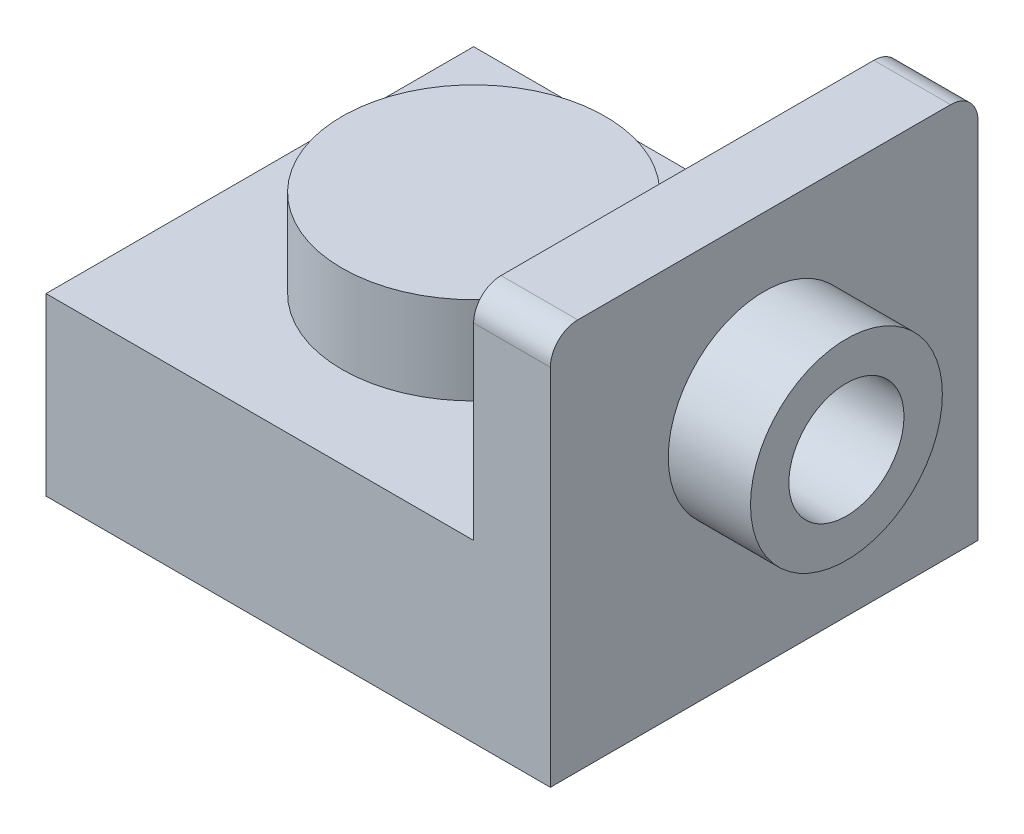
ISO-10303-21;
HEADER;
FILE_DESCRIPTION(('STEP AP214'),'2;1');
FILE_NAME('part.step','',(''),(''),'','','');
FILE_SCHEMA(('AUTOMOTIVE_DESIGN { 1 0 10303 214 1 1 1 1 }'));
ENDSEC;
DATA;
#1=APPLICATION_CONTEXT('core data for automotive mechanical design processes');
#2=APPLICATION_PROTOCOL_DEFINITION('international standard','automotive_design',2000,#1);
#3=PRODUCT_CONTEXT('',#1,'mechanical');
#4=PRODUCT('Part','Part','',(#3));
#5=PRODUCT_RELATED_PRODUCT_CATEGORY('part','',(#4));
#6=PRODUCT_DEFINITION_FORMATION('','',#4);
#7=PRODUCT_DEFINITION_CONTEXT('part definition',#1,'design');
#8=PRODUCT_DEFINITION('design','',#6,#7);
#9=PRODUCT_DEFINITION_SHAPE('','',#8);
#10=(LENGTH_UNIT() NAMED_UNIT(*) SI_UNIT(.MILLI.,.METRE.));
#11=(NAMED_UNIT(*) PLANE_ANGLE_UNIT() SI_UNIT($,.RADIAN.));
#12=(NAMED_UNIT(*) SI_UNIT($,.STERADIAN.) SOLID_ANGLE_UNIT());
#13=UNCERTAINTY_MEASURE_WITH_UNIT(LENGTH_MEASURE(1.E-05),#10,'distance_accuracy_value','');
#14=(GEOMETRIC_REPRESENTATION_CONTEXT(3) GLOBAL_UNCERTAINTY_ASSIGNED_CONTEXT((#13)) GLOBAL_UNIT_ASSIGNED_CONTEXT((#10,
#11,#12)) REPRESENTATION_CONTEXT('',''));
#15=CARTESIAN_POINT('',(0.,0.,0.));
#16=DIRECTION('',(0.,0.,1.));
#17=DIRECTION('',(1.,0.,0.));
#18=AXIS2_PLACEMENT_3D('',#15,#16,#17);
#19=CARTESIAN_POINT('',(0.,0.,-7.8));
#20=DIRECTION('',(-1.,0.,0.));
#21=DIRECTION('',(0.,0.,1.));
#22=AXIS2_PLACEMENT_3D('',#19,#20,#21);
#23=PLANE('',#22);
#24=DIRECTION('',(0.,-1.,0.));
#25=VECTOR('',#24,1.);
#26=CARTESIAN_POINT('',(0.,0.,0.));
#27=LINE('',#26,#25);
#28=CARTESIAN_POINT('',(0.,3.2,0.));
#29=VERTEX_POINT('',#28);
#30=CARTESIAN_POINT('',(0.,0.,0.));
#31=VERTEX_POINT('',#30);
#32=EDGE_CURVE('E205',#29,#31,#27,.T.);
#33=ORIENTED_EDGE('',*,*,#32,.F.);
#34=DIRECTION('',(0.,0.,1.));
#35=VECTOR('',#34,1.);
#36=CARTESIAN_POINT('',(0.,3.2,-7.8));
#37=LINE('',#36,#35);
#38=CARTESIAN_POINT('',(0.,3.2,-7.8));
#39=VERTEX_POINT('',#38);
#40=EDGE_CURVE('E210',#39,#29,#37,.T.);
#41=ORIENTED_EDGE('',*,*,#40,.F.);
#42=DIRECTION('',(0.,-1.,0.));
#43=VECTOR('',#42,1.);
#44=CARTESIAN_POINT('',(0.,0.,-7.8));
#45=LINE('',#44,#43);
#46=CARTESIAN_POINT('',(0.,0.,-7.8));
#47=VERTEX_POINT('',#46);
#48=EDGE_CURVE('E140',#39,#47,#45,.T.);
#49=ORIENTED_EDGE('',*,*,#48,.T.);
#50=DIRECTION('',(0.,0.,1.));
#51=VECTOR('',#50,1.);
#52=CARTESIAN_POINT('',(0.,0.,-7.8));
#53=LINE('',#52,#51);
#54=EDGE_CURVE('E136',#47,#31,#53,.T.);
#55=ORIENTED_EDGE('',*,*,#54,.T.);
#56=EDGE_LOOP('',(#33,#41,#49,#55));
#57=FACE_BOUND('',#56,.T.);
#58=ADVANCED_FACE('F39',(#57),#23,.T.);
#59=CARTESIAN_POINT('',(0.,3.2,-7.8));
#60=DIRECTION('',(0.,1.,0.));
#61=DIRECTION('',(0.,0.,1.));
#62=AXIS2_PLACEMENT_3D('',#59,#60,#61);
#63=PLANE('',#62);
#64=CARTESIAN_POINT('',(3.9,3.2,-3.9));
#65=DIRECTION('',(0.,1.,0.));
#66=DIRECTION('',(0.,0.,1.));
#67=AXIS2_PLACEMENT_3D('',#64,#65,#66);
#68=CIRCLE('',#67,2.4);
#69=CARTESIAN_POINT('',(3.9,3.2,-1.5));
#70=VERTEX_POINT('',#69);
#71=EDGE_CURVE('E206',#70,#70,#68,.T.);
#72=ORIENTED_EDGE('',*,*,#71,.F.);
#73=EDGE_LOOP('',(#72));
#74=FACE_BOUND('',#73,.T.);
#75=DIRECTION('',(-1.,0.,0.));
#76=VECTOR('',#75,1.);
#77=CARTESIAN_POINT('',(0.,3.2,0.));
#78=LINE('',#77,#76);
#79=CARTESIAN_POINT('',(7.8,3.2,0.));
#80=VERTEX_POINT('',#79);
#81=EDGE_CURVE('E211',#80,#29,#78,.T.);
#82=ORIENTED_EDGE('',*,*,#81,.F.);
#83=DIRECTION('',(0.,0.,1.));
#84=VECTOR('',#83,1.);
#85=CARTESIAN_POINT('',(7.8,3.2,-7.8));
#86=LINE('',#85,#84);
#87=CARTESIAN_POINT('',(7.8,3.2,-7.8));
#88=VERTEX_POINT('',#87);
#89=EDGE_CURVE('E222',#88,#80,#86,.T.);
#90=ORIENTED_EDGE('',*,*,#89,.F.);
#91=DIRECTION('',(-1.,0.,0.));
#92=VECTOR('',#91,1.);
#93=CARTESIAN_POINT('',(0.,3.2,-7.8));
#94=LINE('',#93,#92);
#95=EDGE_CURVE('E139',#88,#39,#94,.T.);
#96=ORIENTED_EDGE('',*,*,#95,.T.);
#97=ORIENTED_EDGE('',*,*,#40,.T.);
#98=EDGE_LOOP('',(#82,#90,#96,#97));
#99=FACE_BOUND('',#98,.T.);
#100=ADVANCED_FACE('F250',(#74,#99),#63,.T.);
#101=CARTESIAN_POINT('',(0.,0.,-7.8));
#102=DIRECTION('',(0.,-1.,0.));
#103=DIRECTION('',(0.,0.,-1.));
#104=AXIS2_PLACEMENT_3D('',#101,#102,#103);
#105=PLANE('',#104);
#106=DIRECTION('',(-1.,0.,0.));
#107=VECTOR('',#106,1.);
#108=CARTESIAN_POINT('',(1.2,0.,-1.2));
#109=LINE('',#108,#107);
#110=CARTESIAN_POINT('',(7.7,0.,-1.2));
#111=VERTEX_POINT('',#110);
#112=CARTESIAN_POINT('',(1.2,0.,-1.2));
#113=VERTEX_POINT('',#112);
#114=EDGE_CURVE('E177',#111,#113,#109,.T.);
#115=ORIENTED_EDGE('',*,*,#114,.F.);
#116=DIRECTION('',(0.,0.,1.));
#117=VECTOR('',#116,1.);
#118=CARTESIAN_POINT('',(7.7,0.,-1.2));
#119=LINE('',#118,#117);
#120=CARTESIAN_POINT('',(7.7,0.,-6.6));
#121=VERTEX_POINT('',#120);
#122=EDGE_CURVE('E168',#121,#111,#119,.T.);
#123=ORIENTED_EDGE('',*,*,#122,.F.);
#124=DIRECTION('',(1.,0.,0.));
#125=VECTOR('',#124,1.);
#126=CARTESIAN_POINT('',(7.7,0.,-6.6));
#127=LINE('',#126,#125);
#128=CARTESIAN_POINT('',(1.2,0.,-6.6));
#129=VERTEX_POINT('',#128);
#130=EDGE_CURVE('E171',#129,#121,#127,.T.);
#131=ORIENTED_EDGE('',*,*,#130,.F.);
#132=DIRECTION('',(0.,0.,-1.));
#133=VECTOR('',#132,1.);
#134=CARTESIAN_POINT('',(1.2,0.,-6.6));
#135=LINE('',#134,#133);
#136=EDGE_CURVE('E174',#113,#129,#135,.T.);
#137=ORIENTED_EDGE('',*,*,#136,.F.);
#138=EDGE_LOOP('',(#115,#123,#131,#137));
#139=FACE_BOUND('',#138,.T.);
#140=DIRECTION('',(1.,0.,0.));
#141=VECTOR('',#140,1.);
#142=CARTESIAN_POINT('',(0.,0.,0.));
#143=LINE('',#142,#141);
#144=CARTESIAN_POINT('',(9.2,0.,0.));
#145=VERTEX_POINT('',#144);
#146=EDGE_CURVE('E217',#31,#145,#143,.T.);
#147=ORIENTED_EDGE('',*,*,#146,.F.);
#148=ORIENTED_EDGE('',*,*,#54,.F.);
#149=DIRECTION('',(1.,0.,0.));
#150=VECTOR('',#149,1.);
#151=CARTESIAN_POINT('',(0.,0.,-7.8));
#152=LINE('',#151,#150);
#153=CARTESIAN_POINT('',(9.2,0.,-7.8));
#154=VERTEX_POINT('',#153);
#155=EDGE_CURVE('E131',#47,#154,#152,.T.);
#156=ORIENTED_EDGE('',*,*,#155,.T.);
#157=DIRECTION('',(0.,0.,-1.));
#158=VECTOR('',#157,1.);
#159=CARTESIAN_POINT('',(9.2,0.,-7.8));
#160=LINE('',#159,#158);
#161=EDGE_CURVE('E135',#145,#154,#160,.T.);
#162=ORIENTED_EDGE('',*,*,#161,.F.);
#163=EDGE_LOOP('',(#147,#148,#156,#162));
#164=FACE_BOUND('',#163,.T.);
#165=ADVANCED_FACE('F133',(#139,#164),#105,.T.);
#166=CARTESIAN_POINT('',(0.,0.,-7.8));
#167=DIRECTION('',(0.,0.,-1.));
#168=DIRECTION('',(-1.,0.,0.));
#169=AXIS2_PLACEMENT_3D('',#166,#167,#168);
#170=PLANE('',#169);
#171=DIRECTION('',(0.,1.,0.));
#172=VECTOR('',#171,1.);
#173=CARTESIAN_POINT('',(7.8,7.13462136884857,-7.8));
#174=LINE('',#173,#172);
#175=CARTESIAN_POINT('',(7.8,6.63462136884857,-7.8));
#176=VERTEX_POINT('',#175);
#177=EDGE_CURVE('E161',#88,#176,#174,.T.);
#178=ORIENTED_EDGE('',*,*,#177,.T.);
#179=DIRECTION('',(-1.,0.,0.));
#180=VECTOR('',#179,1.);
#181=CARTESIAN_POINT('',(9.2,6.63462136884857,-7.8));
#182=LINE('',#181,#180);
#183=CARTESIAN_POINT('',(9.2,6.63462136884857,-7.8));
#184=VERTEX_POINT('',#183);
#185=EDGE_CURVE('E62',#176,#184,#182,.F.);
#186=ORIENTED_EDGE('',*,*,#185,.T.);
#187=DIRECTION('',(0.,1.,0.));
#188=VECTOR('',#187,1.);
#189=CARTESIAN_POINT('',(9.2,7.13462136884857,-7.8));
#190=LINE('',#189,#188);
#191=EDGE_CURVE('E142',#154,#184,#190,.T.);
#192=ORIENTED_EDGE('',*,*,#191,.F.);
#193=ORIENTED_EDGE('',*,*,#155,.F.);
#194=ORIENTED_EDGE('',*,*,#48,.F.);
#195=ORIENTED_EDGE('',*,*,#95,.F.);
#196=EDGE_LOOP('',(#178,#186,#192,#193,#194,#195));
#197=FACE_BOUND('',#196,.T.);
#198=ADVANCED_FACE('F143',(#197),#170,.T.);
#199=CARTESIAN_POINT('',(0.,0.,0.));
#200=DIRECTION('',(0.,0.,-1.));
#201=DIRECTION('',(-1.,0.,0.));
#202=AXIS2_PLACEMENT_3D('',#199,#200,#201);
#203=PLANE('',#202);
#204=DIRECTION('',(0.,-1.,0.));
#205=VECTOR('',#204,1.);
#206=CARTESIAN_POINT('',(9.2,0.,0.));
#207=LINE('',#206,#205);
#208=CARTESIAN_POINT('',(9.2,6.63462136884857,0.));
#209=VERTEX_POINT('',#208);
#210=EDGE_CURVE('E148',#209,#145,#207,.T.);
#211=ORIENTED_EDGE('',*,*,#210,.F.);
#212=DIRECTION('',(-1.,0.,0.));
#213=VECTOR('',#212,1.);
#214=CARTESIAN_POINT('',(0.,6.63462136884857,0.));
#215=LINE('',#214,#213);
#216=CARTESIAN_POINT('',(7.8,6.63462136884857,0.));
#217=VERTEX_POINT('',#216);
#218=EDGE_CURVE('E47',#209,#217,#215,.T.);
#219=ORIENTED_EDGE('',*,*,#218,.T.);
#220=DIRECTION('',(0.,-1.,0.));
#221=VECTOR('',#220,1.);
#222=CARTESIAN_POINT('',(7.8,0.,0.));
#223=LINE('',#222,#221);
#224=EDGE_CURVE('E150',#217,#80,#223,.T.);
#225=ORIENTED_EDGE('',*,*,#224,.T.);
#226=ORIENTED_EDGE('',*,*,#81,.T.);
#227=ORIENTED_EDGE('',*,*,#32,.T.);
#228=ORIENTED_EDGE('',*,*,#146,.T.);
#229=EDGE_LOOP('',(#211,#219,#225,#226,#227,#228));
#230=FACE_BOUND('',#229,.T.);
#231=ADVANCED_FACE('F241',(#230),#203,.F.);
#232=CARTESIAN_POINT('',(3.9,4.8,-3.9));
#233=DIRECTION('',(0.,-1.,0.));
#234=DIRECTION('',(0.,0.,-1.));
#235=AXIS2_PLACEMENT_3D('',#232,#233,#234);
#236=CYLINDRICAL_SURFACE('',#235,2.4);
#237=CARTESIAN_POINT('',(3.9,4.8,-3.9));
#238=DIRECTION('',(0.,1.,0.));
#239=DIRECTION('',(0.,0.,1.));
#240=AXIS2_PLACEMENT_3D('',#237,#238,#239);
#241=CIRCLE('',#240,2.4);
#242=CARTESIAN_POINT('',(3.9,4.8,-1.5));
#243=VERTEX_POINT('',#242);
#244=EDGE_CURVE('E202',#243,#243,#241,.T.);
#245=ORIENTED_EDGE('',*,*,#244,.F.);
#246=EDGE_LOOP('',(#245));
#247=FACE_BOUND('',#246,.T.);
#248=ORIENTED_EDGE('',*,*,#71,.T.);
#249=EDGE_LOOP('',(#248));
#250=FACE_BOUND('',#249,.T.);
#251=ADVANCED_FACE('F315',(#247,#250),#236,.T.);
#252=CARTESIAN_POINT('',(3.9,4.8,-3.9));
#253=DIRECTION('',(0.,1.,0.));
#254=DIRECTION('',(0.,0.,1.));
#255=AXIS2_PLACEMENT_3D('',#252,#253,#254);
#256=PLANE('',#255);
#257=ORIENTED_EDGE('',*,*,#244,.T.);
#258=EDGE_LOOP('',(#257));
#259=FACE_BOUND('',#258,.T.);
#260=ADVANCED_FACE('F311',(#259),#256,.T.);
#261=CARTESIAN_POINT('',(0.,3.,-7.8));
#262=DIRECTION('',(0.,1.,0.));
#263=DIRECTION('',(0.,0.,1.));
#264=AXIS2_PLACEMENT_3D('',#261,#262,#263);
#265=PLANE('',#264);
#266=CARTESIAN_POINT('',(3.9,3.,-3.9));
#267=DIRECTION('',(0.,-1.,0.));
#268=DIRECTION('',(0.,0.,-1.));
#269=AXIS2_PLACEMENT_3D('',#266,#267,#268);
#270=CIRCLE('',#269,1.3);
#271=CARTESIAN_POINT('',(3.9,3.,-5.2));
#272=VERTEX_POINT('',#271);
#273=EDGE_CURVE('E160',#272,#272,#270,.T.);
#274=ORIENTED_EDGE('',*,*,#273,.F.);
#275=EDGE_LOOP('',(#274));
#276=FACE_BOUND('',#275,.T.);
#277=DIRECTION('',(0.,0.,1.));
#278=VECTOR('',#277,1.);
#279=CARTESIAN_POINT('',(7.7,3.,-1.2));
#280=LINE('',#279,#278);
#281=CARTESIAN_POINT('',(7.7,3.,-6.6));
#282=VERTEX_POINT('',#281);
#283=CARTESIAN_POINT('',(7.7,3.,-1.2));
#284=VERTEX_POINT('',#283);
#285=EDGE_CURVE('E185',#282,#284,#280,.T.);
#286=ORIENTED_EDGE('',*,*,#285,.T.);
#287=DIRECTION('',(-1.,0.,0.));
#288=VECTOR('',#287,1.);
#289=CARTESIAN_POINT('',(1.2,3.,-1.2));
#290=LINE('',#289,#288);
#291=CARTESIAN_POINT('',(1.2,3.,-1.2));
#292=VERTEX_POINT('',#291);
#293=EDGE_CURVE('E173',#284,#292,#290,.T.);
#294=ORIENTED_EDGE('',*,*,#293,.T.);
#295=DIRECTION('',(0.,0.,-1.));
#296=VECTOR('',#295,1.);
#297=CARTESIAN_POINT('',(1.2,3.,-6.6));
#298=LINE('',#297,#296);
#299=CARTESIAN_POINT('',(1.2,3.,-6.6));
#300=VERTEX_POINT('',#299);
#301=EDGE_CURVE('E194',#292,#300,#298,.T.);
#302=ORIENTED_EDGE('',*,*,#301,.T.);
#303=DIRECTION('',(1.,0.,0.));
#304=VECTOR('',#303,1.);
#305=CARTESIAN_POINT('',(7.7,3.,-6.6));
#306=LINE('',#305,#304);
#307=EDGE_CURVE('E190',#300,#282,#306,.T.);
#308=ORIENTED_EDGE('',*,*,#307,.T.);
#309=EDGE_LOOP('',(#286,#294,#302,#308));
#310=FACE_BOUND('',#309,.T.);
#311=ADVANCED_FACE('F307',(#276,#310),#265,.F.);
#312=CARTESIAN_POINT('',(1.2,11.6504437753292,-1.2));
#313=DIRECTION('',(0.,0.,1.));
#314=DIRECTION('',(1.,0.,0.));
#315=AXIS2_PLACEMENT_3D('',#312,#313,#314);
#316=PLANE('',#315);
#317=DIRECTION('',(0.,-1.,0.));
#318=VECTOR('',#317,1.);
#319=CARTESIAN_POINT('',(7.7,11.6504437753292,-1.2));
#320=LINE('',#319,#318);
#321=EDGE_CURVE('E188',#284,#111,#320,.T.);
#322=ORIENTED_EDGE('',*,*,#321,.T.);
#323=ORIENTED_EDGE('',*,*,#114,.T.);
#324=DIRECTION('',(0.,-1.,0.));
#325=VECTOR('',#324,1.);
#326=CARTESIAN_POINT('',(1.2,11.6504437753292,-1.2));
#327=LINE('',#326,#325);
#328=EDGE_CURVE('E184',#292,#113,#327,.T.);
#329=ORIENTED_EDGE('',*,*,#328,.F.);
#330=ORIENTED_EDGE('',*,*,#293,.F.);
#331=EDGE_LOOP('',(#322,#323,#329,#330));
#332=FACE_BOUND('',#331,.T.);
#333=ADVANCED_FACE('F303',(#332),#316,.F.);
#334=CARTESIAN_POINT('',(1.2,11.6504437753292,-6.6));
#335=DIRECTION('',(-1.,0.,0.));
#336=DIRECTION('',(0.,0.,1.));
#337=AXIS2_PLACEMENT_3D('',#334,#335,#336);
#338=PLANE('',#337);
#339=ORIENTED_EDGE('',*,*,#328,.T.);
#340=ORIENTED_EDGE('',*,*,#136,.T.);
#341=DIRECTION('',(0.,-1.,0.));
#342=VECTOR('',#341,1.);
#343=CARTESIAN_POINT('',(1.2,11.6504437753292,-6.6));
#344=LINE('',#343,#342);
#345=EDGE_CURVE('E193',#300,#129,#344,.T.);
#346=ORIENTED_EDGE('',*,*,#345,.F.);
#347=ORIENTED_EDGE('',*,*,#301,.F.);
#348=EDGE_LOOP('',(#339,#340,#346,#347));
#349=FACE_BOUND('',#348,.T.);
#350=ADVANCED_FACE('F299',(#349),#338,.F.);
#351=CARTESIAN_POINT('',(7.7,11.6504437753292,-6.6));
#352=DIRECTION('',(0.,0.,-1.));
#353=DIRECTION('',(-1.,0.,0.));
#354=AXIS2_PLACEMENT_3D('',#351,#352,#353);
#355=PLANE('',#354);
#356=ORIENTED_EDGE('',*,*,#345,.T.);
#357=ORIENTED_EDGE('',*,*,#130,.T.);
#358=DIRECTION('',(0.,-1.,0.));
#359=VECTOR('',#358,1.);
#360=CARTESIAN_POINT('',(7.7,11.6504437753292,-6.6));
#361=LINE('',#360,#359);
#362=EDGE_CURVE('E189',#282,#121,#361,.T.);
#363=ORIENTED_EDGE('',*,*,#362,.F.);
#364=ORIENTED_EDGE('',*,*,#307,.F.);
#365=EDGE_LOOP('',(#356,#357,#363,#364));
#366=FACE_BOUND('',#365,.T.);
#367=ADVANCED_FACE('F295',(#366),#355,.F.);
#368=CARTESIAN_POINT('',(7.7,11.6504437753292,-1.2));
#369=DIRECTION('',(1.,0.,0.));
#370=DIRECTION('',(0.,0.,-1.));
#371=AXIS2_PLACEMENT_3D('',#368,#369,#370);
#372=PLANE('',#371);
#373=ORIENTED_EDGE('',*,*,#362,.T.);
#374=ORIENTED_EDGE('',*,*,#122,.T.);
#375=ORIENTED_EDGE('',*,*,#321,.F.);
#376=ORIENTED_EDGE('',*,*,#285,.F.);
#377=EDGE_LOOP('',(#373,#374,#375,#376));
#378=FACE_BOUND('',#377,.T.);
#379=ADVANCED_FACE('F291',(#378),#372,.F.);
#380=CARTESIAN_POINT('',(3.9,4.7,-3.9));
#381=DIRECTION('',(0.,-1.,0.));
#382=DIRECTION('',(0.,0.,-1.));
#383=AXIS2_PLACEMENT_3D('',#380,#381,#382);
#384=CYLINDRICAL_SURFACE('',#383,1.3);
#385=CARTESIAN_POINT('',(3.9,4.7,-3.9));
#386=DIRECTION('',(0.,-1.,0.));
#387=DIRECTION('',(0.,0.,-1.));
#388=AXIS2_PLACEMENT_3D('',#385,#386,#387);
#389=CIRCLE('',#388,1.3);
#390=CARTESIAN_POINT('',(3.9,4.7,-5.2));
#391=VERTEX_POINT('',#390);
#392=EDGE_CURVE('E165',#391,#391,#389,.T.);
#393=ORIENTED_EDGE('',*,*,#392,.F.);
#394=EDGE_LOOP('',(#393));
#395=FACE_BOUND('',#394,.T.);
#396=ORIENTED_EDGE('',*,*,#273,.T.);
#397=EDGE_LOOP('',(#396));
#398=FACE_BOUND('',#397,.T.);
#399=ADVANCED_FACE('F285',(#395,#398),#384,.F.);
#400=CARTESIAN_POINT('',(3.9,4.7,-3.9));
#401=DIRECTION('',(0.,-1.,0.));
#402=DIRECTION('',(0.,0.,-1.));
#403=AXIS2_PLACEMENT_3D('',#400,#401,#402);
#404=PLANE('',#403);
#405=ORIENTED_EDGE('',*,*,#392,.T.);
#406=EDGE_LOOP('',(#405));
#407=FACE_BOUND('',#406,.T.);
#408=ADVANCED_FACE('F276',(#407),#404,.T.);
#409=CARTESIAN_POINT('',(9.2,7.13462136884857,0.));
#410=DIRECTION('',(0.,-1.,0.));
#411=DIRECTION('',(0.,0.,-1.));
#412=AXIS2_PLACEMENT_3D('',#409,#410,#411);
#413=PLANE('',#412);
#414=DIRECTION('',(0.,0.,1.));
#415=VECTOR('',#414,1.);
#416=CARTESIAN_POINT('',(9.2,7.13462136884857,0.));
#417=LINE('',#416,#415);
#418=CARTESIAN_POINT('',(9.2,7.13462136884857,-7.3));
#419=VERTEX_POINT('',#418);
#420=CARTESIAN_POINT('',(9.2,7.13462136884857,-0.5));
#421=VERTEX_POINT('',#420);
#422=EDGE_CURVE('E145',#419,#421,#417,.T.);
#423=ORIENTED_EDGE('',*,*,#422,.F.);
#424=DIRECTION('',(-1.,0.,0.));
#425=VECTOR('',#424,1.);
#426=CARTESIAN_POINT('',(7.8,7.13462136884857,-7.3));
#427=LINE('',#426,#425);
#428=CARTESIAN_POINT('',(7.8,7.13462136884857,-7.3));
#429=VERTEX_POINT('',#428);
#430=EDGE_CURVE('E227',#419,#429,#427,.T.);
#431=ORIENTED_EDGE('',*,*,#430,.T.);
#432=DIRECTION('',(0.,0.,1.));
#433=VECTOR('',#432,1.);
#434=CARTESIAN_POINT('',(7.8,7.13462136884857,0.));
#435=LINE('',#434,#433);
#436=CARTESIAN_POINT('',(7.8,7.13462136884857,-0.5));
#437=VERTEX_POINT('',#436);
#438=EDGE_CURVE('E152',#429,#437,#435,.T.);
#439=ORIENTED_EDGE('',*,*,#438,.T.);
#440=DIRECTION('',(-1.,0.,0.));
#441=VECTOR('',#440,1.);
#442=CARTESIAN_POINT('',(9.2,7.13462136884857,-0.5));
#443=LINE('',#442,#441);
#444=EDGE_CURVE('E209',#437,#421,#443,.F.);
#445=ORIENTED_EDGE('',*,*,#444,.T.);
#446=EDGE_LOOP('',(#423,#431,#439,#445));
#447=FACE_BOUND('',#446,.T.);
#448=ADVANCED_FACE('F273',(#447),#413,.F.);
#449=CARTESIAN_POINT('',(9.2,0.,0.));
#450=DIRECTION('',(-1.,0.,0.));
#451=DIRECTION('',(0.,0.,1.));
#452=AXIS2_PLACEMENT_3D('',#449,#450,#451);
#453=PLANE('',#452);
#454=CARTESIAN_POINT('',(9.2,4.13462136884857,-3.9));
#455=DIRECTION('',(-1.,0.,0.));
#456=DIRECTION('',(0.,0.,1.));
#457=AXIS2_PLACEMENT_3D('',#454,#455,#456);
#458=CIRCLE('',#457,1.75);
#459=CARTESIAN_POINT('',(9.2,4.13462136884857,-2.15));
#460=VERTEX_POINT('',#459);
#461=EDGE_CURVE('E12',#460,#460,#458,.F.);
#462=ORIENTED_EDGE('',*,*,#461,.F.);
#463=EDGE_LOOP('',(#462));
#464=FACE_BOUND('',#463,.T.);
#465=ORIENTED_EDGE('',*,*,#191,.T.);
#466=CARTESIAN_POINT('',(9.2,6.63462136884857,-7.3));
#467=DIRECTION('',(-1.,0.,0.));
#468=DIRECTION('',(0.,0.,1.));
#469=AXIS2_PLACEMENT_3D('',#466,#467,#468);
#470=CIRCLE('',#469,0.5);
#471=EDGE_CURVE('E236',#184,#419,#470,.F.);
#472=ORIENTED_EDGE('',*,*,#471,.T.);
#473=ORIENTED_EDGE('',*,*,#422,.T.);
#474=CARTESIAN_POINT('',(9.2,6.63462136884857,-0.5));
#475=DIRECTION('',(-1.,0.,0.));
#476=DIRECTION('',(0.,0.,1.));
#477=AXIS2_PLACEMENT_3D('',#474,#475,#476);
#478=CIRCLE('',#477,0.5);
#479=EDGE_CURVE('E54',#421,#209,#478,.F.);
#480=ORIENTED_EDGE('',*,*,#479,.T.);
#481=ORIENTED_EDGE('',*,*,#210,.T.);
#482=ORIENTED_EDGE('',*,*,#161,.T.);
#483=EDGE_LOOP('',(#465,#472,#473,#480,#481,#482));
#484=FACE_BOUND('',#483,.T.);
#485=ADVANCED_FACE('F147',(#464,#484),#453,.F.);
#486=CARTESIAN_POINT('',(7.8,0.,0.));
#487=DIRECTION('',(-1.,0.,0.));
#488=DIRECTION('',(0.,0.,1.));
#489=AXIS2_PLACEMENT_3D('',#486,#487,#488);
#490=PLANE('',#489);
#491=ORIENTED_EDGE('',*,*,#438,.F.);
#492=CARTESIAN_POINT('',(7.8,6.63462136884857,-7.3));
#493=DIRECTION('',(-1.,0.,0.));
#494=DIRECTION('',(0.,0.,1.));
#495=AXIS2_PLACEMENT_3D('',#492,#493,#494);
#496=CIRCLE('',#495,0.5);
#497=EDGE_CURVE('E232',#429,#176,#496,.T.);
#498=ORIENTED_EDGE('',*,*,#497,.T.);
#499=ORIENTED_EDGE('',*,*,#177,.F.);
#500=ORIENTED_EDGE('',*,*,#89,.T.);
#501=ORIENTED_EDGE('',*,*,#224,.F.);
#502=CARTESIAN_POINT('',(7.8,6.63462136884857,-0.5));
#503=DIRECTION('',(-1.,0.,0.));
#504=DIRECTION('',(0.,0.,1.));
#505=AXIS2_PLACEMENT_3D('',#502,#503,#504);
#506=CIRCLE('',#505,0.5);
#507=EDGE_CURVE('E230',#217,#437,#506,.T.);
#508=ORIENTED_EDGE('',*,*,#507,.T.);
#509=EDGE_LOOP('',(#491,#498,#499,#500,#501,#508));
#510=FACE_BOUND('',#509,.T.);
#511=ADVANCED_FACE('F246',(#510),#490,.T.);
#512=CARTESIAN_POINT('',(9.2,6.63462136884857,-7.3));
#513=DIRECTION('',(1.,0.,0.));
#514=DIRECTION('',(0.,0.,-1.));
#515=AXIS2_PLACEMENT_3D('',#512,#513,#514);
#516=CYLINDRICAL_SURFACE('',#515,0.5);
#517=ORIENTED_EDGE('',*,*,#471,.F.);
#518=ORIENTED_EDGE('',*,*,#185,.F.);
#519=ORIENTED_EDGE('',*,*,#497,.F.);
#520=ORIENTED_EDGE('',*,*,#430,.F.);
#521=EDGE_LOOP('',(#517,#518,#519,#520));
#522=FACE_BOUND('',#521,.T.);
#523=ADVANCED_FACE('F261',(#522),#516,.T.);
#524=CARTESIAN_POINT('',(0.,6.63462136884857,-0.5));
#525=DIRECTION('',(-1.,0.,0.));
#526=DIRECTION('',(0.,0.,1.));
#527=AXIS2_PLACEMENT_3D('',#524,#525,#526);
#528=CYLINDRICAL_SURFACE('',#527,0.5);
#529=ORIENTED_EDGE('',*,*,#479,.F.);
#530=ORIENTED_EDGE('',*,*,#444,.F.);
#531=ORIENTED_EDGE('',*,*,#507,.F.);
#532=ORIENTED_EDGE('',*,*,#218,.F.);
#533=EDGE_LOOP('',(#529,#530,#531,#532));
#534=FACE_BOUND('',#533,.T.);
#535=ADVANCED_FACE('F41',(#534),#528,.T.);
#536=CARTESIAN_POINT('',(10.7,4.13462136884857,-3.9));
#537=DIRECTION('',(1.,0.,0.));
#538=DIRECTION('',(0.,0.,-1.));
#539=AXIS2_PLACEMENT_3D('',#536,#537,#538);
#540=PLANE('',#539);
#541=CARTESIAN_POINT('',(10.7,4.13462136884857,-3.9));
#542=DIRECTION('',(1.,0.,0.));
#543=DIRECTION('',(0.,0.,-1.));
#544=AXIS2_PLACEMENT_3D('',#541,#542,#543);
#545=CIRCLE('',#544,1.75);
#546=CARTESIAN_POINT('',(10.7,4.13462136884857,-5.65));
#547=VERTEX_POINT('',#546);
#548=EDGE_CURVE('E155',#547,#547,#545,.T.);
#549=ORIENTED_EDGE('',*,*,#548,.T.);
#550=EDGE_LOOP('',(#549));
#551=FACE_BOUND('',#550,.T.);
#552=CARTESIAN_POINT('',(10.7,4.13462136884857,-3.9));
#553=DIRECTION('',(1.,0.,0.));
#554=DIRECTION('',(0.,0.,-1.));
#555=AXIS2_PLACEMENT_3D('',#552,#553,#554);
#556=CIRCLE('',#555,1.05);
#557=CARTESIAN_POINT('',(10.7,4.13462136884857,-4.95));
#558=VERTEX_POINT('',#557);
#559=EDGE_CURVE('E459',#558,#558,#556,.T.);
#560=ORIENTED_EDGE('',*,*,#559,.F.);
#561=EDGE_LOOP('',(#560));
#562=FACE_BOUND('',#561,.T.);
#563=ADVANCED_FACE('F268',(#551,#562),#540,.T.);
#564=CARTESIAN_POINT('',(10.7,4.13462136884857,-3.9));
#565=DIRECTION('',(-1.,0.,0.));
#566=DIRECTION('',(0.,0.,1.));
#567=AXIS2_PLACEMENT_3D('',#564,#565,#566);
#568=CYLINDRICAL_SURFACE('',#567,1.75);
#569=ORIENTED_EDGE('',*,*,#548,.F.);
#570=EDGE_LOOP('',(#569));
#571=FACE_BOUND('',#570,.T.);
#572=ORIENTED_EDGE('',*,*,#461,.T.);
#573=EDGE_LOOP('',(#572));
#574=FACE_BOUND('',#573,.T.);
#575=ADVANCED_FACE('F433',(#571,#574),#568,.T.);
#576=CARTESIAN_POINT('',(10.7,4.13462136884857,-3.9));
#577=DIRECTION('',(-1.,0.,0.));
#578=DIRECTION('',(0.,0.,1.));
#579=AXIS2_PLACEMENT_3D('',#576,#577,#578);
#580=CYLINDRICAL_SURFACE('',#579,1.05);
#581=ORIENTED_EDGE('',*,*,#559,.T.);
#582=EDGE_LOOP('',(#581));
#583=FACE_BOUND('',#582,.T.);
#584=CARTESIAN_POINT('',(9.2,4.13462136884857,-3.9));
#585=DIRECTION('',(1.,0.,0.));
#586=DIRECTION('',(0.,0.,-1.));
#587=AXIS2_PLACEMENT_3D('',#584,#585,#586);
#588=CIRCLE('',#587,1.05);
#589=CARTESIAN_POINT('',(9.2,4.13462136884857,-4.95));
#590=VERTEX_POINT('',#589);
#591=EDGE_CURVE('E462',#590,#590,#588,.T.);
#592=ORIENTED_EDGE('',*,*,#591,.F.);
#593=EDGE_LOOP('',(#592));
#594=FACE_BOUND('',#593,.T.);
#595=ADVANCED_FACE('F425',(#583,#594),#580,.F.);
#596=ORIENTED_EDGE('',*,*,#591,.T.);
#597=EDGE_LOOP('',(#596));
#598=FACE_BOUND('',#597,.T.);
#599=ADVANCED_FACE('F284',(#598),#453,.F.);
#600=CLOSED_SHELL('',(#58,#100,#165,#198,#231,#251,#260,#311,#333,#350,#367,#379,#399,#408,#448,
#485,#511,#523,#535,#563,#575,#595,#599));
#601=MANIFOLD_SOLID_BREP('B2',#600);
#602=ADVANCED_BREP_SHAPE_REPRESENTATION('',(#18,#601),#14);
#603=SHAPE_DEFINITION_REPRESENTATION(#9,#602);
ENDSEC;
END-ISO-10303-21;
